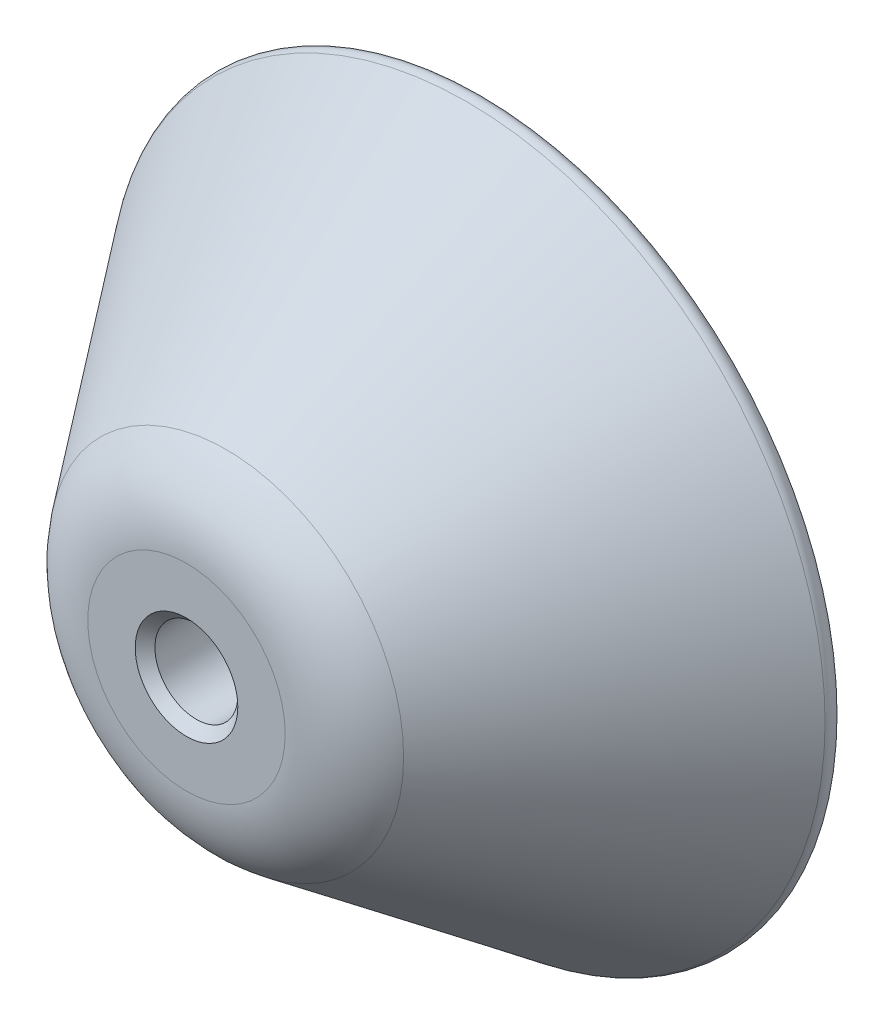
ISO-10303-21;
HEADER;
FILE_DESCRIPTION(('STEP AP214'),'2;1');
FILE_NAME('part.step','',(''),(''),'','','');
FILE_SCHEMA(('AUTOMOTIVE_DESIGN { 1 0 10303 214 1 1 1 1 }'));
ENDSEC;
DATA;
#1=APPLICATION_CONTEXT('core data for automotive mechanical design processes');
#2=APPLICATION_PROTOCOL_DEFINITION('international standard','automotive_design',2000,#1);
#3=PRODUCT_CONTEXT('',#1,'mechanical');
#4=PRODUCT('Part','Part','',(#3));
#5=PRODUCT_RELATED_PRODUCT_CATEGORY('part','',(#4));
#6=PRODUCT_DEFINITION_FORMATION('','',#4);
#7=PRODUCT_DEFINITION_CONTEXT('part definition',#1,'design');
#8=PRODUCT_DEFINITION('design','',#6,#7);
#9=PRODUCT_DEFINITION_SHAPE('','',#8);
#10=(LENGTH_UNIT() NAMED_UNIT(*) SI_UNIT(.MILLI.,.METRE.));
#11=(NAMED_UNIT(*) PLANE_ANGLE_UNIT() SI_UNIT($,.RADIAN.));
#12=(NAMED_UNIT(*) SI_UNIT($,.STERADIAN.) SOLID_ANGLE_UNIT());
#13=UNCERTAINTY_MEASURE_WITH_UNIT(LENGTH_MEASURE(1.E-05),#10,'distance_accuracy_value','');
#14=(GEOMETRIC_REPRESENTATION_CONTEXT(3) GLOBAL_UNCERTAINTY_ASSIGNED_CONTEXT((#13)) GLOBAL_UNIT_ASSIGNED_CONTEXT((#10,
#11,#12)) REPRESENTATION_CONTEXT('',''));
#15=CARTESIAN_POINT('',(0.,0.,0.));
#16=DIRECTION('',(0.,0.,1.));
#17=DIRECTION('',(1.,0.,0.));
#18=AXIS2_PLACEMENT_3D('',#15,#16,#17);
#19=CARTESIAN_POINT('',(-37.5,0.,0.));
#20=DIRECTION('',(0.,0.,-1.));
#21=DIRECTION('',(-1.,0.,0.));
#22=AXIS2_PLACEMENT_3D('',#19,#20,#21);
#23=PLANE('',#22);
#24=DIRECTION('',(-1.,0.,0.));
#25=VECTOR('',#24,1.);
#26=CARTESIAN_POINT('',(-37.5,8.188,0.));
#27=LINE('',#26,#25);
#28=CARTESIAN_POINT('',(4.72734400412465,8.188,0.));
#29=VERTEX_POINT('',#28);
#30=CARTESIAN_POINT('',(-4.72734400412466,8.188,0.));
#31=VERTEX_POINT('',#30);
#32=EDGE_CURVE('E172',#29,#31,#27,.T.);
#33=ORIENTED_EDGE('',*,*,#32,.T.);
#34=DIRECTION('',(-0.5,-0.866025403784439,0.));
#35=VECTOR('',#34,1.);
#36=CARTESIAN_POINT('',(-16.466016006187,-12.1439763209582,0.));
#37=LINE('',#36,#35);
#38=CARTESIAN_POINT('',(-9.45468800824931,0.,0.));
#39=VERTEX_POINT('',#38);
#40=EDGE_CURVE('E182',#31,#39,#37,.T.);
#41=ORIENTED_EDGE('',*,*,#40,.T.);
#42=DIRECTION('',(0.5,-0.866025403784439,0.));
#43=VECTOR('',#42,1.);
#44=CARTESIAN_POINT('',(-16.466016006187,12.1439763209582,0.));
#45=LINE('',#44,#43);
#46=CARTESIAN_POINT('',(-4.72734400412465,-8.188,0.));
#47=VERTEX_POINT('',#46);
#48=EDGE_CURVE('E180',#39,#47,#45,.T.);
#49=ORIENTED_EDGE('',*,*,#48,.T.);
#50=DIRECTION('',(1.,0.,0.));
#51=VECTOR('',#50,1.);
#52=CARTESIAN_POINT('',(-37.5,-8.188,0.));
#53=LINE('',#52,#51);
#54=CARTESIAN_POINT('',(4.72734400412467,-8.188,0.));
#55=VERTEX_POINT('',#54);
#56=EDGE_CURVE('E178',#47,#55,#53,.T.);
#57=ORIENTED_EDGE('',*,*,#56,.T.);
#58=DIRECTION('',(0.5,0.866025403784439,0.));
#59=VECTOR('',#58,1.);
#60=CARTESIAN_POINT('',(-2.283983993813,-20.3319763209582,0.));
#61=LINE('',#60,#59);
#62=CARTESIAN_POINT('',(9.45468800824931,0.,0.));
#63=VERTEX_POINT('',#62);
#64=EDGE_CURVE('E176',#55,#63,#61,.T.);
#65=ORIENTED_EDGE('',*,*,#64,.T.);
#66=DIRECTION('',(-0.5,0.866025403784439,0.));
#67=VECTOR('',#66,1.);
#68=CARTESIAN_POINT('',(-2.28398399381302,20.3319763209582,0.));
#69=LINE('',#68,#67);
#70=EDGE_CURVE('E174',#63,#29,#69,.T.);
#71=ORIENTED_EDGE('',*,*,#70,.T.);
#72=EDGE_LOOP('',(#33,#41,#49,#57,#65,#71));
#73=FACE_BOUND('',#72,.T.);
#74=CARTESIAN_POINT('',(0.,0.,0.));
#75=DIRECTION('',(0.,0.,-1.));
#76=DIRECTION('',(-1.,0.,0.));
#77=AXIS2_PLACEMENT_3D('',#74,#75,#76);
#78=CIRCLE('',#77,35.5);
#79=CARTESIAN_POINT('',(-35.5,0.,0.));
#80=VERTEX_POINT('',#79);
#81=EDGE_CURVE('E112',#80,#80,#78,.T.);
#82=ORIENTED_EDGE('',*,*,#81,.T.);
#83=EDGE_LOOP('',(#82));
#84=FACE_BOUND('',#83,.T.);
#85=ADVANCED_FACE('F34',(#73,#84),#23,.T.);
#86=CARTESIAN_POINT('',(0.,0.,0.));
#87=DIRECTION('',(0.,0.,1.));
#88=DIRECTION('',(1.,0.,0.));
#89=AXIS2_PLACEMENT_3D('',#86,#87,#88);
#90=CYLINDRICAL_SURFACE('',#89,4.2);
#91=CARTESIAN_POINT('',(0.,0.,9.00000000000001));
#92=DIRECTION('',(0.,0.,-1.));
#93=DIRECTION('',(-1.,0.,0.));
#94=AXIS2_PLACEMENT_3D('',#91,#92,#93);
#95=CIRCLE('',#94,4.2);
#96=CARTESIAN_POINT('',(-4.2,0.,9.00000000000001));
#97=VERTEX_POINT('',#96);
#98=EDGE_CURVE('E166',#97,#97,#95,.T.);
#99=ORIENTED_EDGE('',*,*,#98,.T.);
#100=EDGE_LOOP('',(#99));
#101=FACE_BOUND('',#100,.T.);
#102=CARTESIAN_POINT('',(0.,0.,29.));
#103=DIRECTION('',(0.,0.,1.));
#104=DIRECTION('',(1.,0.,0.));
#105=AXIS2_PLACEMENT_3D('',#102,#103,#104);
#106=CIRCLE('',#105,4.2);
#107=CARTESIAN_POINT('',(4.2,0.,29.));
#108=VERTEX_POINT('',#107);
#109=EDGE_CURVE('E163',#108,#108,#106,.T.);
#110=ORIENTED_EDGE('',*,*,#109,.T.);
#111=EDGE_LOOP('',(#110));
#112=FACE_BOUND('',#111,.T.);
#113=ADVANCED_FACE('F251',(#101,#112),#90,.F.);
#114=CARTESIAN_POINT('',(0.,0.,0.));
#115=DIRECTION('',(0.,0.,-1.));
#116=DIRECTION('',(-1.,0.,0.));
#117=AXIS2_PLACEMENT_3D('',#114,#115,#116);
#118=CONICAL_SURFACE('',#117,37.5,0.643501108793284);
#119=CARTESIAN_POINT('',(0.,0.,26.));
#120=DIRECTION('',(0.,0.,1.));
#121=DIRECTION('',(1.,0.,0.));
#122=AXIS2_PLACEMENT_3D('',#119,#120,#121);
#123=CIRCLE('',#122,18.);
#124=CARTESIAN_POINT('',(18.,0.,26.));
#125=VERTEX_POINT('',#124);
#126=EDGE_CURVE('E154',#125,#125,#123,.F.);
#127=ORIENTED_EDGE('',*,*,#126,.T.);
#128=EDGE_LOOP('',(#127));
#129=FACE_BOUND('',#128,.T.);
#130=CARTESIAN_POINT('',(0.,0.,1.6));
#131=DIRECTION('',(0.,0.,1.));
#132=DIRECTION('',(1.,0.,0.));
#133=AXIS2_PLACEMENT_3D('',#130,#131,#132);
#134=CIRCLE('',#133,36.3);
#135=CARTESIAN_POINT('',(36.3,0.,1.59999999999999));
#136=VERTEX_POINT('',#135);
#137=EDGE_CURVE('E151',#136,#136,#134,.T.);
#138=ORIENTED_EDGE('',*,*,#137,.T.);
#139=EDGE_LOOP('',(#138));
#140=FACE_BOUND('',#139,.T.);
#141=ADVANCED_FACE('F256',(#129,#140),#118,.T.);
#142=CARTESIAN_POINT('',(0.,0.,30.));
#143=DIRECTION('',(0.,0.,1.));
#144=DIRECTION('',(1.,0.,0.));
#145=AXIS2_PLACEMENT_3D('',#142,#143,#144);
#146=PLANE('',#145);
#147=CARTESIAN_POINT('',(0.,0.,30.));
#148=DIRECTION('',(0.,0.,1.));
#149=DIRECTION('',(1.,0.,0.));
#150=AXIS2_PLACEMENT_3D('',#147,#148,#149);
#151=CIRCLE('',#150,5.2);
#152=CARTESIAN_POINT('',(5.2,0.,30.));
#153=VERTEX_POINT('',#152);
#154=EDGE_CURVE('E11',#153,#153,#151,.F.);
#155=ORIENTED_EDGE('',*,*,#154,.T.);
#156=EDGE_LOOP('',(#155));
#157=FACE_BOUND('',#156,.T.);
#158=CARTESIAN_POINT('',(0.,0.,30.));
#159=DIRECTION('',(0.,0.,1.));
#160=DIRECTION('',(1.,0.,0.));
#161=AXIS2_PLACEMENT_3D('',#158,#159,#160);
#162=CIRCLE('',#161,10.);
#163=CARTESIAN_POINT('',(10.,0.,30.));
#164=VERTEX_POINT('',#163);
#165=EDGE_CURVE('E157',#164,#164,#162,.T.);
#166=ORIENTED_EDGE('',*,*,#165,.T.);
#167=EDGE_LOOP('',(#166));
#168=FACE_BOUND('',#167,.T.);
#169=ADVANCED_FACE('F261',(#157,#168),#146,.T.);
#170=CARTESIAN_POINT('',(0.,0.,0.999999999999998));
#171=DIRECTION('',(0.,0.,-1.));
#172=DIRECTION('',(-1.,0.,0.));
#173=AXIS2_PLACEMENT_3D('',#170,#171,#172);
#174=TOROIDAL_SURFACE('',#173,35.5,1.);
#175=ORIENTED_EDGE('',*,*,#137,.F.);
#176=EDGE_LOOP('',(#175));
#177=FACE_BOUND('',#176,.T.);
#178=ORIENTED_EDGE('',*,*,#81,.F.);
#179=EDGE_LOOP('',(#178));
#180=FACE_BOUND('',#179,.T.);
#181=ADVANCED_FACE('F265',(#177,#180),#174,.T.);
#182=CARTESIAN_POINT('',(0.,0.,20.));
#183=DIRECTION('',(0.,0.,1.));
#184=DIRECTION('',(1.,0.,0.));
#185=AXIS2_PLACEMENT_3D('',#182,#183,#184);
#186=DEGENERATE_TOROIDAL_SURFACE('',#185,10.,10.,.T.);
#187=ORIENTED_EDGE('',*,*,#165,.F.);
#188=EDGE_LOOP('',(#187));
#189=FACE_BOUND('',#188,.T.);
#190=ORIENTED_EDGE('',*,*,#126,.F.);
#191=EDGE_LOOP('',(#190));
#192=FACE_BOUND('',#191,.T.);
#193=ADVANCED_FACE('F268',(#189,#192),#186,.T.);
#194=CARTESIAN_POINT('',(0.,0.,8.));
#195=DIRECTION('',(0.,0.,-1.));
#196=DIRECTION('',(-1.,0.,0.));
#197=AXIS2_PLACEMENT_3D('',#194,#195,#196);
#198=PLANE('',#197);
#199=CARTESIAN_POINT('',(0.,0.,8.));
#200=DIRECTION('',(0.,0.,-1.));
#201=DIRECTION('',(-1.,0.,0.));
#202=AXIS2_PLACEMENT_3D('',#199,#200,#201);
#203=CIRCLE('',#202,5.2);
#204=CARTESIAN_POINT('',(-5.2,0.,8.));
#205=VERTEX_POINT('',#204);
#206=EDGE_CURVE('E160',#205,#205,#203,.F.);
#207=ORIENTED_EDGE('',*,*,#206,.T.);
#208=EDGE_LOOP('',(#207));
#209=FACE_BOUND('',#208,.T.);
#210=DIRECTION('',(0.5,-0.866025403784438,0.));
#211=VECTOR('',#210,1.);
#212=CARTESIAN_POINT('',(4.14999373493503,7.188,8.));
#213=LINE('',#212,#211);
#214=CARTESIAN_POINT('',(4.14999373493503,7.188,8.));
#215=VERTEX_POINT('',#214);
#216=CARTESIAN_POINT('',(8.29998746987006,0.,8.));
#217=VERTEX_POINT('',#216);
#218=EDGE_CURVE('E109',#215,#217,#213,.T.);
#219=ORIENTED_EDGE('',*,*,#218,.T.);
#220=DIRECTION('',(-0.5,-0.866025403784439,0.));
#221=VECTOR('',#220,1.);
#222=CARTESIAN_POINT('',(8.29998746987006,0.,8.));
#223=LINE('',#222,#221);
#224=CARTESIAN_POINT('',(4.14999373493503,-7.188,8.));
#225=VERTEX_POINT('',#224);
#226=EDGE_CURVE('E116',#217,#225,#223,.T.);
#227=ORIENTED_EDGE('',*,*,#226,.T.);
#228=DIRECTION('',(-1.,0.,0.));
#229=VECTOR('',#228,1.);
#230=CARTESIAN_POINT('',(4.14999373493503,-7.188,8.));
#231=LINE('',#230,#229);
#232=CARTESIAN_POINT('',(-4.14999373493503,-7.188,8.));
#233=VERTEX_POINT('',#232);
#234=EDGE_CURVE('E122',#225,#233,#231,.T.);
#235=ORIENTED_EDGE('',*,*,#234,.T.);
#236=DIRECTION('',(-0.5,0.866025403784439,0.));
#237=VECTOR('',#236,1.);
#238=CARTESIAN_POINT('',(-4.14999373493503,-7.188,8.));
#239=LINE('',#238,#237);
#240=CARTESIAN_POINT('',(-8.29998746987006,0.,8.));
#241=VERTEX_POINT('',#240);
#242=EDGE_CURVE('E134',#233,#241,#239,.T.);
#243=ORIENTED_EDGE('',*,*,#242,.T.);
#244=DIRECTION('',(0.5,0.866025403784439,0.));
#245=VECTOR('',#244,1.);
#246=CARTESIAN_POINT('',(-8.29998746987006,0.,8.));
#247=LINE('',#246,#245);
#248=CARTESIAN_POINT('',(-4.14999373493503,7.188,8.));
#249=VERTEX_POINT('',#248);
#250=EDGE_CURVE('E137',#241,#249,#247,.T.);
#251=ORIENTED_EDGE('',*,*,#250,.T.);
#252=DIRECTION('',(1.,0.,0.));
#253=VECTOR('',#252,1.);
#254=CARTESIAN_POINT('',(-4.14999373493503,7.188,8.));
#255=LINE('',#254,#253);
#256=EDGE_CURVE('E128',#249,#215,#255,.T.);
#257=ORIENTED_EDGE('',*,*,#256,.T.);
#258=EDGE_LOOP('',(#219,#227,#235,#243,#251,#257));
#259=FACE_BOUND('',#258,.T.);
#260=ADVANCED_FACE('F125',(#209,#259),#198,.T.);
#261=CARTESIAN_POINT('',(4.14999373493503,7.188,0.));
#262=DIRECTION('',(-0.866025403784438,-0.5,0.));
#263=DIRECTION('',(0.5,-0.866025403784439,0.));
#264=AXIS2_PLACEMENT_3D('',#261,#262,#263);
#265=PLANE('',#264);
#266=DIRECTION('',(0.,0.,1.));
#267=VECTOR('',#266,1.);
#268=CARTESIAN_POINT('',(4.14999373493503,7.188,0.));
#269=LINE('',#268,#267);
#270=CARTESIAN_POINT('',(4.14999373493503,7.188,0.999999999999998));
#271=VERTEX_POINT('',#270);
#272=EDGE_CURVE('E140',#271,#215,#269,.T.);
#273=ORIENTED_EDGE('',*,*,#272,.F.);
#274=DIRECTION('',(0.5,-0.866025403784439,0.));
#275=VECTOR('',#274,1.);
#276=CARTESIAN_POINT('',(4.14999373493503,7.188,0.999999999999999));
#277=LINE('',#276,#275);
#278=CARTESIAN_POINT('',(8.29998746987006,0.,0.999999999999998));
#279=VERTEX_POINT('',#278);
#280=EDGE_CURVE('E57',#271,#279,#277,.T.);
#281=ORIENTED_EDGE('',*,*,#280,.T.);
#282=DIRECTION('',(0.,0.,1.));
#283=VECTOR('',#282,1.);
#284=CARTESIAN_POINT('',(8.29998746987006,0.,0.));
#285=LINE('',#284,#283);
#286=EDGE_CURVE('E105',#279,#217,#285,.T.);
#287=ORIENTED_EDGE('',*,*,#286,.T.);
#288=ORIENTED_EDGE('',*,*,#218,.F.);
#289=EDGE_LOOP('',(#273,#281,#287,#288));
#290=FACE_BOUND('',#289,.T.);
#291=ADVANCED_FACE('F107',(#290),#265,.T.);
#292=CARTESIAN_POINT('',(8.29998746987006,0.,0.));
#293=DIRECTION('',(-0.866025403784439,0.5,0.));
#294=DIRECTION('',(-0.5,-0.866025403784439,0.));
#295=AXIS2_PLACEMENT_3D('',#292,#293,#294);
#296=PLANE('',#295);
#297=ORIENTED_EDGE('',*,*,#286,.F.);
#298=DIRECTION('',(-0.5,-0.866025403784439,0.));
#299=VECTOR('',#298,1.);
#300=CARTESIAN_POINT('',(8.29998746987006,0.,0.999999999999997));
#301=LINE('',#300,#299);
#302=CARTESIAN_POINT('',(4.14999373493503,-7.188,0.999999999999998));
#303=VERTEX_POINT('',#302);
#304=EDGE_CURVE('E189',#279,#303,#301,.T.);
#305=ORIENTED_EDGE('',*,*,#304,.T.);
#306=DIRECTION('',(0.,0.,1.));
#307=VECTOR('',#306,1.);
#308=CARTESIAN_POINT('',(4.14999373493503,-7.188,0.));
#309=LINE('',#308,#307);
#310=EDGE_CURVE('E113',#303,#225,#309,.T.);
#311=ORIENTED_EDGE('',*,*,#310,.T.);
#312=ORIENTED_EDGE('',*,*,#226,.F.);
#313=EDGE_LOOP('',(#297,#305,#311,#312));
#314=FACE_BOUND('',#313,.T.);
#315=ADVANCED_FACE('F117',(#314),#296,.T.);
#316=CARTESIAN_POINT('',(4.14999373493503,-7.188,0.));
#317=DIRECTION('',(0.,1.,0.));
#318=DIRECTION('',(0.,0.,1.));
#319=AXIS2_PLACEMENT_3D('',#316,#317,#318);
#320=PLANE('',#319);
#321=ORIENTED_EDGE('',*,*,#310,.F.);
#322=DIRECTION('',(-1.,0.,0.));
#323=VECTOR('',#322,1.);
#324=CARTESIAN_POINT('',(4.14999373493503,-7.188,0.999999999999998));
#325=LINE('',#324,#323);
#326=CARTESIAN_POINT('',(-4.14999373493503,-7.188,0.999999999999999));
#327=VERTEX_POINT('',#326);
#328=EDGE_CURVE('E187',#303,#327,#325,.T.);
#329=ORIENTED_EDGE('',*,*,#328,.T.);
#330=DIRECTION('',(0.,0.,1.));
#331=VECTOR('',#330,1.);
#332=CARTESIAN_POINT('',(-4.14999373493503,-7.188,0.));
#333=LINE('',#332,#331);
#334=EDGE_CURVE('E146',#327,#233,#333,.T.);
#335=ORIENTED_EDGE('',*,*,#334,.T.);
#336=ORIENTED_EDGE('',*,*,#234,.F.);
#337=EDGE_LOOP('',(#321,#329,#335,#336));
#338=FACE_BOUND('',#337,.T.);
#339=ADVANCED_FACE('F214',(#338),#320,.T.);
#340=CARTESIAN_POINT('',(-4.14999373493503,-7.188,0.));
#341=DIRECTION('',(0.866025403784439,0.5,0.));
#342=DIRECTION('',(-0.5,0.866025403784439,0.));
#343=AXIS2_PLACEMENT_3D('',#340,#341,#342);
#344=PLANE('',#343);
#345=ORIENTED_EDGE('',*,*,#334,.F.);
#346=DIRECTION('',(-0.5,0.866025403784439,0.));
#347=VECTOR('',#346,1.);
#348=CARTESIAN_POINT('',(-4.14999373493503,-7.188,0.999999999999999));
#349=LINE('',#348,#347);
#350=CARTESIAN_POINT('',(-8.29998746987006,0.,0.999999999999999));
#351=VERTEX_POINT('',#350);
#352=EDGE_CURVE('E185',#327,#351,#349,.T.);
#353=ORIENTED_EDGE('',*,*,#352,.T.);
#354=DIRECTION('',(0.,0.,1.));
#355=VECTOR('',#354,1.);
#356=CARTESIAN_POINT('',(-8.29998746987006,0.,0.));
#357=LINE('',#356,#355);
#358=EDGE_CURVE('E144',#351,#241,#357,.T.);
#359=ORIENTED_EDGE('',*,*,#358,.T.);
#360=ORIENTED_EDGE('',*,*,#242,.F.);
#361=EDGE_LOOP('',(#345,#353,#359,#360));
#362=FACE_BOUND('',#361,.T.);
#363=ADVANCED_FACE('F219',(#362),#344,.T.);
#364=CARTESIAN_POINT('',(-8.29998746987006,0.,0.));
#365=DIRECTION('',(0.866025403784439,-0.5,0.));
#366=DIRECTION('',(0.5,0.866025403784439,0.));
#367=AXIS2_PLACEMENT_3D('',#364,#365,#366);
#368=PLANE('',#367);
#369=ORIENTED_EDGE('',*,*,#358,.F.);
#370=DIRECTION('',(0.5,0.866025403784439,0.));
#371=VECTOR('',#370,1.);
#372=CARTESIAN_POINT('',(-8.29998746987006,0.,1.));
#373=LINE('',#372,#371);
#374=CARTESIAN_POINT('',(-4.14999373493503,7.188,0.999999999999999));
#375=VERTEX_POINT('',#374);
#376=EDGE_CURVE('E169',#351,#375,#373,.T.);
#377=ORIENTED_EDGE('',*,*,#376,.T.);
#378=DIRECTION('',(0.,0.,1.));
#379=VECTOR('',#378,1.);
#380=CARTESIAN_POINT('',(-4.14999373493503,7.188,0.));
#381=LINE('',#380,#379);
#382=EDGE_CURVE('E142',#375,#249,#381,.T.);
#383=ORIENTED_EDGE('',*,*,#382,.T.);
#384=ORIENTED_EDGE('',*,*,#250,.F.);
#385=EDGE_LOOP('',(#369,#377,#383,#384));
#386=FACE_BOUND('',#385,.T.);
#387=ADVANCED_FACE('F225',(#386),#368,.T.);
#388=CARTESIAN_POINT('',(-4.14999373493503,7.188,0.));
#389=DIRECTION('',(0.,-1.,0.));
#390=DIRECTION('',(0.,0.,-1.));
#391=AXIS2_PLACEMENT_3D('',#388,#389,#390);
#392=PLANE('',#391);
#393=ORIENTED_EDGE('',*,*,#382,.F.);
#394=DIRECTION('',(1.,0.,0.));
#395=VECTOR('',#394,1.);
#396=CARTESIAN_POINT('',(-4.14999373493503,7.188,0.999999999999999));
#397=LINE('',#396,#395);
#398=EDGE_CURVE('E43',#375,#271,#397,.T.);
#399=ORIENTED_EDGE('',*,*,#398,.T.);
#400=ORIENTED_EDGE('',*,*,#272,.T.);
#401=ORIENTED_EDGE('',*,*,#256,.F.);
#402=EDGE_LOOP('',(#393,#399,#400,#401));
#403=FACE_BOUND('',#402,.T.);
#404=ADVANCED_FACE('F275',(#403),#392,.T.);
#405=CARTESIAN_POINT('',(0.,0.,8.));
#406=DIRECTION('',(0.,0.,-1.));
#407=DIRECTION('',(-1.,0.,0.));
#408=AXIS2_PLACEMENT_3D('',#405,#406,#407);
#409=CONICAL_SURFACE('',#408,5.2,0.785398163397442);
#410=ORIENTED_EDGE('',*,*,#98,.F.);
#411=EDGE_LOOP('',(#410));
#412=FACE_BOUND('',#411,.T.);
#413=ORIENTED_EDGE('',*,*,#206,.F.);
#414=EDGE_LOOP('',(#413));
#415=FACE_BOUND('',#414,.T.);
#416=ADVANCED_FACE('F249',(#412,#415),#409,.F.);
#417=CARTESIAN_POINT('',(8.29998746987006,0.,0.999999999999998));
#418=DIRECTION('',(0.612372435695794,-0.353553390593273,0.707106781186549));
#419=DIRECTION('',(-0.5,-0.866025403784439,0.));
#420=AXIS2_PLACEMENT_3D('',#417,#418,#419);
#421=PLANE('',#420);
#422=DIRECTION('',(-0.755928946018454,0.,0.654653670707977));
#423=VECTOR('',#422,1.);
#424=CARTESIAN_POINT('',(8.29998746987006,0.,0.999999999999998));
#425=LINE('',#424,#423);
#426=EDGE_CURVE('E131',#63,#279,#425,.T.);
#427=ORIENTED_EDGE('',*,*,#426,.F.);
#428=ORIENTED_EDGE('',*,*,#64,.F.);
#429=DIRECTION('',(-0.37796447300923,0.654653670707976,0.654653670707977));
#430=VECTOR('',#429,1.);
#431=CARTESIAN_POINT('',(4.14999373493503,-7.188,0.999999999999998));
#432=LINE('',#431,#430);
#433=EDGE_CURVE('E38',#303,#55,#432,.F.);
#434=ORIENTED_EDGE('',*,*,#433,.F.);
#435=ORIENTED_EDGE('',*,*,#304,.F.);
#436=EDGE_LOOP('',(#427,#428,#434,#435));
#437=FACE_BOUND('',#436,.T.);
#438=ADVANCED_FACE('F210',(#437),#421,.F.);
#439=CARTESIAN_POINT('',(4.14999373493503,-7.188,0.999999999999998));
#440=DIRECTION('',(0.,-0.707106781186548,0.707106781186547));
#441=DIRECTION('',(-1.,0.,0.));
#442=AXIS2_PLACEMENT_3D('',#439,#440,#441);
#443=PLANE('',#442);
#444=ORIENTED_EDGE('',*,*,#433,.T.);
#445=ORIENTED_EDGE('',*,*,#56,.F.);
#446=DIRECTION('',(0.377964473009227,0.654653670707977,0.654653670707977));
#447=VECTOR('',#446,1.);
#448=CARTESIAN_POINT('',(-4.14999373493503,-7.188,0.999999999999999));
#449=LINE('',#448,#447);
#450=EDGE_CURVE('E200',#327,#47,#449,.F.);
#451=ORIENTED_EDGE('',*,*,#450,.F.);
#452=ORIENTED_EDGE('',*,*,#328,.F.);
#453=EDGE_LOOP('',(#444,#445,#451,#452));
#454=FACE_BOUND('',#453,.T.);
#455=ADVANCED_FACE('F241',(#454),#443,.F.);
#456=CARTESIAN_POINT('',(4.14999373493503,7.188,0.999999999999998));
#457=DIRECTION('',(0.612372435695796,0.353553390593275,0.707106781186546));
#458=DIRECTION('',(0.5,-0.866025403784439,0.));
#459=AXIS2_PLACEMENT_3D('',#456,#457,#458);
#460=PLANE('',#459);
#461=ORIENTED_EDGE('',*,*,#426,.T.);
#462=ORIENTED_EDGE('',*,*,#280,.F.);
#463=DIRECTION('',(-0.377964473009224,-0.654653670707978,0.654653670707978));
#464=VECTOR('',#463,1.);
#465=CARTESIAN_POINT('',(4.14999373493503,7.188,0.999999999999998));
#466=LINE('',#465,#464);
#467=EDGE_CURVE('E197',#29,#271,#466,.T.);
#468=ORIENTED_EDGE('',*,*,#467,.F.);
#469=ORIENTED_EDGE('',*,*,#70,.F.);
#470=EDGE_LOOP('',(#461,#462,#468,#469));
#471=FACE_BOUND('',#470,.T.);
#472=ADVANCED_FACE('F206',(#471),#460,.F.);
#473=CARTESIAN_POINT('',(-4.14999373493503,-7.188,0.999999999999999));
#474=DIRECTION('',(-0.612372435695794,-0.353553390593274,0.707106781186547));
#475=DIRECTION('',(-0.5,0.866025403784439,0.));
#476=AXIS2_PLACEMENT_3D('',#473,#474,#475);
#477=PLANE('',#476);
#478=ORIENTED_EDGE('',*,*,#450,.T.);
#479=ORIENTED_EDGE('',*,*,#48,.F.);
#480=DIRECTION('',(0.755928946018455,0.,0.654653670707977));
#481=VECTOR('',#480,1.);
#482=CARTESIAN_POINT('',(-8.29998746987006,0.,1.));
#483=LINE('',#482,#481);
#484=EDGE_CURVE('E195',#351,#39,#483,.F.);
#485=ORIENTED_EDGE('',*,*,#484,.F.);
#486=ORIENTED_EDGE('',*,*,#352,.F.);
#487=EDGE_LOOP('',(#478,#479,#485,#486));
#488=FACE_BOUND('',#487,.T.);
#489=ADVANCED_FACE('F229',(#488),#477,.F.);
#490=CARTESIAN_POINT('',(-4.14999373493503,7.188,0.999999999999999));
#491=DIRECTION('',(0.,0.707106781186547,0.707106781186547));
#492=DIRECTION('',(1.,0.,0.));
#493=AXIS2_PLACEMENT_3D('',#490,#491,#492);
#494=PLANE('',#493);
#495=ORIENTED_EDGE('',*,*,#467,.T.);
#496=ORIENTED_EDGE('',*,*,#398,.F.);
#497=DIRECTION('',(-0.377964473009228,0.654653670707977,-0.654653670707977));
#498=VECTOR('',#497,1.);
#499=CARTESIAN_POINT('',(-2.96428123923931,5.13428571428572,3.05371428571428));
#500=LINE('',#499,#498);
#501=EDGE_CURVE('E193',#31,#375,#500,.F.);
#502=ORIENTED_EDGE('',*,*,#501,.F.);
#503=ORIENTED_EDGE('',*,*,#32,.F.);
#504=EDGE_LOOP('',(#495,#496,#502,#503));
#505=FACE_BOUND('',#504,.T.);
#506=ADVANCED_FACE('F236',(#505),#494,.F.);
#507=CARTESIAN_POINT('',(-8.29998746987006,0.,1.));
#508=DIRECTION('',(-0.612372435695794,0.353553390593274,0.707106781186548));
#509=DIRECTION('',(0.5,0.866025403784439,0.));
#510=AXIS2_PLACEMENT_3D('',#507,#508,#509);
#511=PLANE('',#510);
#512=ORIENTED_EDGE('',*,*,#484,.T.);
#513=ORIENTED_EDGE('',*,*,#40,.F.);
#514=ORIENTED_EDGE('',*,*,#501,.T.);
#515=ORIENTED_EDGE('',*,*,#376,.F.);
#516=EDGE_LOOP('',(#512,#513,#514,#515));
#517=FACE_BOUND('',#516,.T.);
#518=ADVANCED_FACE('F232',(#517),#511,.F.);
#519=CARTESIAN_POINT('',(0.,0.,29.));
#520=DIRECTION('',(0.,0.,1.));
#521=DIRECTION('',(1.,0.,0.));
#522=AXIS2_PLACEMENT_3D('',#519,#520,#521);
#523=CONICAL_SURFACE('',#522,4.2,0.785398163397447);
#524=ORIENTED_EDGE('',*,*,#154,.F.);
#525=EDGE_LOOP('',(#524));
#526=FACE_BOUND('',#525,.T.);
#527=ORIENTED_EDGE('',*,*,#109,.F.);
#528=EDGE_LOOP('',(#527));
#529=FACE_BOUND('',#528,.T.);
#530=ADVANCED_FACE('F36',(#526,#529),#523,.F.);
#531=CLOSED_SHELL('',(#85,#113,#141,#169,#181,#193,#260,#291,#315,#339,#363,#387,#404,#416,#438,
#455,#472,#489,#506,#518,#530));
#532=MANIFOLD_SOLID_BREP('B2',#531);
#533=ADVANCED_BREP_SHAPE_REPRESENTATION('',(#18,#532),#14);
#534=SHAPE_DEFINITION_REPRESENTATION(#9,#533);
ENDSEC;
END-ISO-10303-21;
